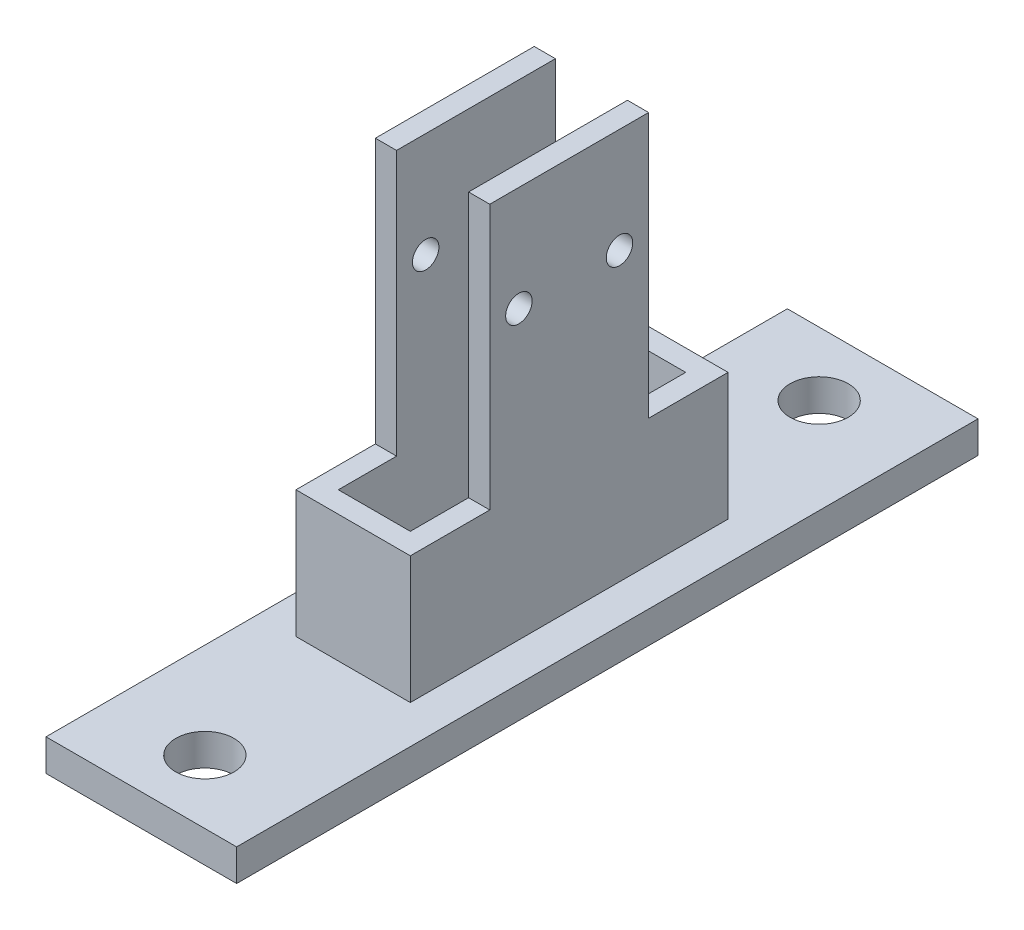
ISO-10303-21;
HEADER;
FILE_DESCRIPTION(('STEP AP214'),'2;1');
FILE_NAME('part.step','',(''),(''),'','','');
FILE_SCHEMA(('AUTOMOTIVE_DESIGN { 1 0 10303 214 1 1 1 1 }'));
ENDSEC;
DATA;
#1=APPLICATION_CONTEXT('core data for automotive mechanical design processes');
#2=APPLICATION_PROTOCOL_DEFINITION('international standard','automotive_design',2000,#1);
#3=PRODUCT_CONTEXT('',#1,'mechanical');
#4=PRODUCT('Part','Part','',(#3));
#5=PRODUCT_RELATED_PRODUCT_CATEGORY('part','',(#4));
#6=PRODUCT_DEFINITION_FORMATION('','',#4);
#7=PRODUCT_DEFINITION_CONTEXT('part definition',#1,'design');
#8=PRODUCT_DEFINITION('design','',#6,#7);
#9=PRODUCT_DEFINITION_SHAPE('','',#8);
#10=(LENGTH_UNIT() NAMED_UNIT(*) SI_UNIT(.MILLI.,.METRE.));
#11=(NAMED_UNIT(*) PLANE_ANGLE_UNIT() SI_UNIT($,.RADIAN.));
#12=(NAMED_UNIT(*) SI_UNIT($,.STERADIAN.) SOLID_ANGLE_UNIT());
#13=UNCERTAINTY_MEASURE_WITH_UNIT(LENGTH_MEASURE(1.E-05),#10,'distance_accuracy_value','');
#14=(GEOMETRIC_REPRESENTATION_CONTEXT(3) GLOBAL_UNCERTAINTY_ASSIGNED_CONTEXT((#13)) GLOBAL_UNIT_ASSIGNED_CONTEXT((#10,
#11,#12)) REPRESENTATION_CONTEXT('',''));
#15=CARTESIAN_POINT('',(0.,0.,0.));
#16=DIRECTION('',(0.,0.,1.));
#17=DIRECTION('',(1.,0.,0.));
#18=AXIS2_PLACEMENT_3D('',#15,#16,#17);
#19=CARTESIAN_POINT('',(0.,3.,0.));
#20=DIRECTION('',(0.,-1.00000000000002,0.));
#21=DIRECTION('',(0.,0.,-1.00000000000002));
#22=AXIS2_PLACEMENT_3D('',#19,#20,#21);
#23=PLANE('',#22);
#24=CARTESIAN_POINT('',(0.,3.00000000000056,-29.0000000000001));
#25=DIRECTION('',(0.,1.00000000000002,0.));
#26=DIRECTION('',(0.,0.,1.00000000000002));
#27=AXIS2_PLACEMENT_3D('',#24,#25,#26);
#28=CIRCLE('',#27,2.75);
#29=CARTESIAN_POINT('',(0.,3.00000000000056,-26.25));
#30=VERTEX_POINT('',#29);
#31=EDGE_CURVE('E593',#30,#30,#28,.T.);
#32=ORIENTED_EDGE('',*,*,#31,.F.);
#33=EDGE_LOOP('',(#32));
#34=FACE_BOUND('',#33,.T.);
#35=CARTESIAN_POINT('',(0.,3.00000000000034,29.));
#36=DIRECTION('',(0.,1.00000000000002,0.));
#37=DIRECTION('',(0.,0.,1.00000000000002));
#38=AXIS2_PLACEMENT_3D('',#35,#36,#37);
#39=CIRCLE('',#38,2.75);
#40=CARTESIAN_POINT('',(0.,3.00000000000034,31.7500000000001));
#41=VERTEX_POINT('',#40);
#42=EDGE_CURVE('E595',#41,#41,#39,.T.);
#43=ORIENTED_EDGE('',*,*,#42,.F.);
#44=EDGE_LOOP('',(#43));
#45=FACE_BOUND('',#44,.T.);
#46=DIRECTION('',(1.,0.,0.));
#47=VECTOR('',#46,1.);
#48=CARTESIAN_POINT('',(-22.5,2.99999999999911,15.0000000000002));
#49=LINE('',#48,#47);
#50=CARTESIAN_POINT('',(-5.40000000000007,2.99999999999917,15.0000000000002));
#51=VERTEX_POINT('',#50);
#52=CARTESIAN_POINT('',(5.40000000000007,3.,14.9999999999998));
#53=VERTEX_POINT('',#52);
#54=EDGE_CURVE('E230',#51,#53,#49,.T.);
#55=ORIENTED_EDGE('',*,*,#54,.F.);
#56=DIRECTION('',(0.,0.,1.00000000000002));
#57=VECTOR('',#56,1.);
#58=CARTESIAN_POINT('',(-5.40000000000007,2.99999999999923,2.22044604925031E-13));
#59=LINE('',#58,#57);
#60=CARTESIAN_POINT('',(-5.40000000000007,2.99999999999945,-15.0000000000002));
#61=VERTEX_POINT('',#60);
#62=EDGE_CURVE('E11',#61,#51,#59,.T.);
#63=ORIENTED_EDGE('',*,*,#62,.F.);
#64=DIRECTION('',(1.,0.,0.));
#65=VECTOR('',#64,1.);
#66=CARTESIAN_POINT('',(-22.5,3.,-15.0000000000003));
#67=LINE('',#66,#65);
#68=CARTESIAN_POINT('',(5.40000000000007,3.,-15.0000000000003));
#69=VERTEX_POINT('',#68);
#70=EDGE_CURVE('E223',#61,#69,#67,.T.);
#71=ORIENTED_EDGE('',*,*,#70,.T.);
#72=DIRECTION('',(0.,0.,1.00000000000002));
#73=VECTOR('',#72,1.);
#74=CARTESIAN_POINT('',(5.40000000000007,3.,-2.22044604925031E-13));
#75=LINE('',#74,#73);
#76=EDGE_CURVE('E306',#69,#53,#75,.T.);
#77=ORIENTED_EDGE('',*,*,#76,.T.);
#78=EDGE_LOOP('',(#55,#63,#71,#77));
#79=FACE_BOUND('',#78,.T.);
#80=DIRECTION('',(0.,0.,-1.00000000000002));
#81=VECTOR('',#80,1.);
#82=CARTESIAN_POINT('',(8.99999999999991,2.99999999999989,-35.0000000000005));
#83=LINE('',#82,#81);
#84=CARTESIAN_POINT('',(9.00000000000012,3.00000000000022,35.));
#85=VERTEX_POINT('',#84);
#86=CARTESIAN_POINT('',(8.99999999999991,2.99999999999989,-35.0000000000005));
#87=VERTEX_POINT('',#86);
#88=EDGE_CURVE('E214',#85,#87,#83,.T.);
#89=ORIENTED_EDGE('',*,*,#88,.T.);
#90=DIRECTION('',(-1.,0.,0.));
#91=VECTOR('',#90,1.);
#92=CARTESIAN_POINT('',(-8.99999999999989,2.99999999999923,-35.0000000000005));
#93=LINE('',#92,#91);
#94=CARTESIAN_POINT('',(-8.99999999999989,2.99999999999923,-35.0000000000005));
#95=VERTEX_POINT('',#94);
#96=EDGE_CURVE('E202',#87,#95,#93,.T.);
#97=ORIENTED_EDGE('',*,*,#96,.T.);
#98=DIRECTION('',(0.,0.,1.00000000000002));
#99=VECTOR('',#98,1.);
#100=CARTESIAN_POINT('',(-8.99999999999989,2.99999999999923,-35.0000000000005));
#101=LINE('',#100,#99);
#102=CARTESIAN_POINT('',(-8.9999999999999,2.99999999999956,35.0000000000003));
#103=VERTEX_POINT('',#102);
#104=EDGE_CURVE('E218',#95,#103,#101,.T.);
#105=ORIENTED_EDGE('',*,*,#104,.T.);
#106=DIRECTION('',(1.,0.,0.));
#107=VECTOR('',#106,1.);
#108=CARTESIAN_POINT('',(-8.9999999999999,2.99999999999956,35.0000000000003));
#109=LINE('',#108,#107);
#110=EDGE_CURVE('E195',#103,#85,#109,.T.);
#111=ORIENTED_EDGE('',*,*,#110,.T.);
#112=EDGE_LOOP('',(#89,#97,#105,#111));
#113=FACE_BOUND('',#112,.T.);
#114=ADVANCED_FACE('F45',(#34,#45,#79,#113),#23,.F.);
#115=CARTESIAN_POINT('',(0.,0.,0.));
#116=DIRECTION('',(0.,-1.00000000000002,0.));
#117=DIRECTION('',(0.,0.,-1.00000000000002));
#118=AXIS2_PLACEMENT_3D('',#115,#116,#117);
#119=PLANE('',#118);
#120=CARTESIAN_POINT('',(0.,0.,-29.0000000000001));
#121=DIRECTION('',(0.,1.00000000000002,0.));
#122=DIRECTION('',(0.,0.,1.00000000000002));
#123=AXIS2_PLACEMENT_3D('',#120,#121,#122);
#124=CIRCLE('',#123,2.75);
#125=CARTESIAN_POINT('',(0.,0.,-26.25));
#126=VERTEX_POINT('',#125);
#127=EDGE_CURVE('E590',#126,#126,#124,.T.);
#128=ORIENTED_EDGE('',*,*,#127,.T.);
#129=EDGE_LOOP('',(#128));
#130=FACE_BOUND('',#129,.T.);
#131=CARTESIAN_POINT('',(0.,2.77555756156289E-13,29.));
#132=DIRECTION('',(0.,1.00000000000002,0.));
#133=DIRECTION('',(0.,0.,1.00000000000002));
#134=AXIS2_PLACEMENT_3D('',#131,#132,#133);
#135=CIRCLE('',#134,2.75);
#136=CARTESIAN_POINT('',(0.,2.77555756156289E-13,31.7500000000001));
#137=VERTEX_POINT('',#136);
#138=EDGE_CURVE('E216',#137,#137,#135,.T.);
#139=ORIENTED_EDGE('',*,*,#138,.T.);
#140=EDGE_LOOP('',(#139));
#141=FACE_BOUND('',#140,.T.);
#142=DIRECTION('',(-1.,0.,0.));
#143=VECTOR('',#142,1.);
#144=CARTESIAN_POINT('',(-8.99999999999989,-7.7715611723761E-13,-35.0000000000005));
#145=LINE('',#144,#143);
#146=CARTESIAN_POINT('',(8.99999999999992,-1.11022302462516E-13,-35.0000000000006));
#147=VERTEX_POINT('',#146);
#148=CARTESIAN_POINT('',(-8.99999999999989,-7.7715611723761E-13,-35.0000000000005));
#149=VERTEX_POINT('',#148);
#150=EDGE_CURVE('E194',#147,#149,#145,.T.);
#151=ORIENTED_EDGE('',*,*,#150,.F.);
#152=DIRECTION('',(0.,0.,-1.00000000000002));
#153=VECTOR('',#152,1.);
#154=CARTESIAN_POINT('',(8.99999999999992,-1.11022302462516E-13,-35.0000000000006));
#155=LINE('',#154,#153);
#156=CARTESIAN_POINT('',(8.99999999999989,3.33066907387547E-13,35.0000000000003));
#157=VERTEX_POINT('',#156);
#158=EDGE_CURVE('E183',#157,#147,#155,.T.);
#159=ORIENTED_EDGE('',*,*,#158,.F.);
#160=DIRECTION('',(1.,0.,0.));
#161=VECTOR('',#160,1.);
#162=CARTESIAN_POINT('',(-8.9999999999999,-4.44089209850063E-13,35.0000000000003));
#163=LINE('',#162,#161);
#164=CARTESIAN_POINT('',(-8.9999999999999,-4.44089209850063E-13,35.0000000000003));
#165=VERTEX_POINT('',#164);
#166=EDGE_CURVE('E204',#165,#157,#163,.T.);
#167=ORIENTED_EDGE('',*,*,#166,.F.);
#168=DIRECTION('',(0.,0.,1.00000000000002));
#169=VECTOR('',#168,1.);
#170=CARTESIAN_POINT('',(-8.99999999999989,-7.7715611723761E-13,-35.0000000000005));
#171=LINE('',#170,#169);
#172=EDGE_CURVE('E207',#149,#165,#171,.T.);
#173=ORIENTED_EDGE('',*,*,#172,.F.);
#174=EDGE_LOOP('',(#151,#159,#167,#173));
#175=FACE_BOUND('',#174,.T.);
#176=ADVANCED_FACE('F206',(#130,#141,#175),#119,.T.);
#177=CARTESIAN_POINT('',(-22.5,2.99999999999911,15.0000000000002));
#178=DIRECTION('',(0.,0.,-1.00000000000002));
#179=DIRECTION('',(-1.,0.,0.));
#180=AXIS2_PLACEMENT_3D('',#177,#178,#179);
#181=PLANE('',#180);
#182=DIRECTION('',(0.,-1.00000000000002,0.));
#183=VECTOR('',#182,1.);
#184=CARTESIAN_POINT('',(-5.40000000000007,-8.32667268468867E-13,15.0000000000002));
#185=LINE('',#184,#183);
#186=CARTESIAN_POINT('',(-5.40000000000006,14.9999999999992,14.9999999999995));
#187=VERTEX_POINT('',#186);
#188=EDGE_CURVE('E319',#187,#51,#185,.T.);
#189=ORIENTED_EDGE('',*,*,#188,.T.);
#190=ORIENTED_EDGE('',*,*,#54,.T.);
#191=DIRECTION('',(0.,-1.00000000000002,0.));
#192=VECTOR('',#191,1.);
#193=CARTESIAN_POINT('',(5.40000000000007,0.,14.9999999999998));
#194=LINE('',#193,#192);
#195=CARTESIAN_POINT('',(5.40000000000009,15.,14.9999999999995));
#196=VERTEX_POINT('',#195);
#197=EDGE_CURVE('E261',#196,#53,#194,.T.);
#198=ORIENTED_EDGE('',*,*,#197,.F.);
#199=DIRECTION('',(1.,0.,0.));
#200=VECTOR('',#199,1.);
#201=CARTESIAN_POINT('',(-5.40000000000006,14.9999999999992,14.9999999999995));
#202=LINE('',#201,#200);
#203=EDGE_CURVE('E336',#187,#196,#202,.T.);
#204=ORIENTED_EDGE('',*,*,#203,.F.);
#205=EDGE_LOOP('',(#189,#190,#198,#204));
#206=FACE_BOUND('',#205,.T.);
#207=ADVANCED_FACE('F47',(#206),#181,.F.);
#208=CARTESIAN_POINT('',(-22.5,3.,-15.0000000000003));
#209=DIRECTION('',(0.,0.,-1.00000000000002));
#210=DIRECTION('',(-1.,0.,0.));
#211=AXIS2_PLACEMENT_3D('',#208,#209,#210);
#212=PLANE('',#211);
#213=ORIENTED_EDGE('',*,*,#70,.F.);
#214=DIRECTION('',(0.,-1.00000000000002,0.));
#215=VECTOR('',#214,1.);
#216=CARTESIAN_POINT('',(-5.40000000000007,-8.32667268468867E-13,-14.9999999999998));
#217=LINE('',#216,#215);
#218=CARTESIAN_POINT('',(-5.40000000000006,14.9999999999997,-15.0000000000005));
#219=VERTEX_POINT('',#218);
#220=EDGE_CURVE('E322',#219,#61,#217,.T.);
#221=ORIENTED_EDGE('',*,*,#220,.F.);
#222=DIRECTION('',(1.,0.,0.));
#223=VECTOR('',#222,1.);
#224=CARTESIAN_POINT('',(-5.40000000000006,14.9999999999997,-15.0000000000005));
#225=LINE('',#224,#223);
#226=CARTESIAN_POINT('',(5.40000000000008,15.0000000000001,-15.0000000000006));
#227=VERTEX_POINT('',#226);
#228=EDGE_CURVE('E365',#219,#227,#225,.T.);
#229=ORIENTED_EDGE('',*,*,#228,.T.);
#230=DIRECTION('',(0.,-1.00000000000002,0.));
#231=VECTOR('',#230,1.);
#232=CARTESIAN_POINT('',(5.40000000000007,0.,-15.0000000000003));
#233=LINE('',#232,#231);
#234=EDGE_CURVE('E264',#227,#69,#233,.T.);
#235=ORIENTED_EDGE('',*,*,#234,.T.);
#236=EDGE_LOOP('',(#213,#221,#229,#235));
#237=FACE_BOUND('',#236,.T.);
#238=ADVANCED_FACE('F428',(#237),#212,.T.);
#239=DIRECTION('',(0.,0.,1.00000000000002));
#240=VECTOR('',#239,1.);
#241=CARTESIAN_POINT('',(3.40000000000007,3.,-2.22044604925031E-13));
#242=LINE('',#241,#240);
#243=CARTESIAN_POINT('',(3.40000000000007,3.,-13.0000000000003));
#244=VERTEX_POINT('',#243);
#245=CARTESIAN_POINT('',(3.40000000000006,3.,12.9999999999998));
#246=VERTEX_POINT('',#245);
#247=EDGE_CURVE('E298',#244,#246,#242,.T.);
#248=ORIENTED_EDGE('',*,*,#247,.F.);
#249=DIRECTION('',(1.,0.,0.));
#250=VECTOR('',#249,1.);
#251=CARTESIAN_POINT('',(-5.40000000000007,2.99999999999928,-13.0000000000002));
#252=LINE('',#251,#250);
#253=CARTESIAN_POINT('',(-3.40000000000007,3.,-12.9999999999998));
#254=VERTEX_POINT('',#253);
#255=EDGE_CURVE('E60',#254,#244,#252,.T.);
#256=ORIENTED_EDGE('',*,*,#255,.F.);
#257=DIRECTION('',(0.,0.,1.00000000000002));
#258=VECTOR('',#257,1.);
#259=CARTESIAN_POINT('',(-3.40000000000007,3.00000000000006,2.22044604925031E-13));
#260=LINE('',#259,#258);
#261=CARTESIAN_POINT('',(-3.40000000000008,3.,13.0000000000002));
#262=VERTEX_POINT('',#261);
#263=EDGE_CURVE('E53',#254,#262,#260,.T.);
#264=ORIENTED_EDGE('',*,*,#263,.T.);
#265=DIRECTION('',(1.,0.,0.));
#266=VECTOR('',#265,1.);
#267=CARTESIAN_POINT('',(-5.40000000000007,2.99999999999911,13.0000000000002));
#268=LINE('',#267,#266);
#269=EDGE_CURVE('E240',#262,#246,#268,.T.);
#270=ORIENTED_EDGE('',*,*,#269,.T.);
#271=EDGE_LOOP('',(#248,#256,#264,#270));
#272=FACE_BOUND('',#271,.T.);
#273=ADVANCED_FACE('F368',(#272),#23,.F.);
#274=CARTESIAN_POINT('',(-5.40000000000007,-7.7715611723761E-13,2.22044604925031E-13));
#275=DIRECTION('',(1.,0.,0.));
#276=DIRECTION('',(0.,0.,-1.00000000000002));
#277=AXIS2_PLACEMENT_3D('',#274,#275,#276);
#278=PLANE('',#277);
#279=CARTESIAN_POINT('',(-5.40000000000163,30.0999999999994,-4.74999999999964));
#280=DIRECTION('',(1.,0.,0.));
#281=DIRECTION('',(0.,0.,-1.00000000000002));
#282=AXIS2_PLACEMENT_3D('',#279,#280,#281);
#283=CIRCLE('',#282,1.25);
#284=CARTESIAN_POINT('',(-5.40000000000163,30.0999999999994,-5.99999999999966));
#285=VERTEX_POINT('',#284);
#286=EDGE_CURVE('E310',#285,#285,#283,.T.);
#287=ORIENTED_EDGE('',*,*,#286,.T.);
#288=EDGE_LOOP('',(#287));
#289=FACE_BOUND('',#288,.T.);
#290=CARTESIAN_POINT('',(-5.40000000000163,30.0999999999993,4.75000000000048));
#291=DIRECTION('',(1.,0.,0.));
#292=DIRECTION('',(0.,0.,-1.00000000000002));
#293=AXIS2_PLACEMENT_3D('',#290,#291,#292);
#294=CIRCLE('',#293,1.25);
#295=CARTESIAN_POINT('',(-5.40000000000163,30.0999999999993,3.50000000000045));
#296=VERTEX_POINT('',#295);
#297=EDGE_CURVE('E313',#296,#296,#294,.T.);
#298=ORIENTED_EDGE('',*,*,#297,.T.);
#299=EDGE_LOOP('',(#298));
#300=FACE_BOUND('',#299,.T.);
#301=DIRECTION('',(0.,-1.00000000000002,0.));
#302=VECTOR('',#301,1.);
#303=CARTESIAN_POINT('',(-5.40000000000007,-7.21644966006352E-13,-7.49999999999979));
#304=LINE('',#303,#302);
#305=CARTESIAN_POINT('',(-5.40000000000139,39.9999999999999,-7.49999999999962));
#306=VERTEX_POINT('',#305);
#307=CARTESIAN_POINT('',(-5.40000000000006,14.9999999999993,-7.50000000000051));
#308=VERTEX_POINT('',#307);
#309=EDGE_CURVE('E327',#306,#308,#304,.T.);
#310=ORIENTED_EDGE('',*,*,#309,.T.);
#311=DIRECTION('',(0.,0.,1.00000000000002));
#312=VECTOR('',#311,1.);
#313=CARTESIAN_POINT('',(-5.40000000000007,14.9999999999993,-4.9960036108132E-13));
#314=LINE('',#313,#312);
#315=EDGE_CURVE('E325',#219,#308,#314,.T.);
#316=ORIENTED_EDGE('',*,*,#315,.F.);
#317=ORIENTED_EDGE('',*,*,#220,.T.);
#318=ORIENTED_EDGE('',*,*,#62,.T.);
#319=ORIENTED_EDGE('',*,*,#188,.F.);
#320=DIRECTION('',(0.,0.,1.00000000000002));
#321=VECTOR('',#320,1.);
#322=CARTESIAN_POINT('',(-5.40000000000007,14.9999999999993,-4.9960036108132E-13));
#323=LINE('',#322,#321);
#324=CARTESIAN_POINT('',(-5.40000000000007,14.9999999999992,7.49999999999951));
#325=VERTEX_POINT('',#324);
#326=EDGE_CURVE('E317',#325,#187,#323,.T.);
#327=ORIENTED_EDGE('',*,*,#326,.F.);
#328=DIRECTION('',(0.,-1.00000000000002,0.));
#329=VECTOR('',#328,1.);
#330=CARTESIAN_POINT('',(-5.40000000000007,-8.88178419700125E-13,7.50000000000023));
#331=LINE('',#330,#329);
#332=CARTESIAN_POINT('',(-5.4000000000014,39.9999999999995,7.50000000000045));
#333=VERTEX_POINT('',#332);
#334=EDGE_CURVE('E333',#333,#325,#331,.T.);
#335=ORIENTED_EDGE('',*,*,#334,.F.);
#336=DIRECTION('',(0.,0.,-1.00000000000002));
#337=VECTOR('',#336,1.);
#338=CARTESIAN_POINT('',(-5.40000000000163,39.9999999999995,3.88578058618805E-13));
#339=LINE('',#338,#337);
#340=EDGE_CURVE('E330',#333,#306,#339,.T.);
#341=ORIENTED_EDGE('',*,*,#340,.T.);
#342=EDGE_LOOP('',(#310,#316,#317,#318,#319,#327,#335,#341));
#343=FACE_BOUND('',#342,.T.);
#344=ADVANCED_FACE('F404',(#289,#300,#343),#278,.F.);
#345=CARTESIAN_POINT('',(-3.40000000000007,0.,2.22044604925031E-13));
#346=DIRECTION('',(1.,0.,0.));
#347=DIRECTION('',(0.,0.,-1.00000000000002));
#348=AXIS2_PLACEMENT_3D('',#345,#346,#347);
#349=PLANE('',#348);
#350=DIRECTION('',(0.,-1.00000000000002,0.));
#351=VECTOR('',#350,1.);
#352=CARTESIAN_POINT('',(-3.40000000000007,0.,-12.9999999999998));
#353=LINE('',#352,#351);
#354=CARTESIAN_POINT('',(-3.40000000000006,15.0000000000001,-13.0000000000006));
#355=VERTEX_POINT('',#354);
#356=EDGE_CURVE('E67',#355,#254,#353,.T.);
#357=ORIENTED_EDGE('',*,*,#356,.F.);
#358=DIRECTION('',(0.,0.,1.00000000000002));
#359=VECTOR('',#358,1.);
#360=CARTESIAN_POINT('',(-3.40000000000007,15.0000000000001,-4.9960036108132E-13));
#361=LINE('',#360,#359);
#362=CARTESIAN_POINT('',(-3.40000000000007,15.0000000000001,-7.50000000000051));
#363=VERTEX_POINT('',#362);
#364=EDGE_CURVE('E345',#355,#363,#361,.T.);
#365=ORIENTED_EDGE('',*,*,#364,.T.);
#366=DIRECTION('',(0.,-1.00000000000002,0.));
#367=VECTOR('',#366,1.);
#368=CARTESIAN_POINT('',(-3.40000000000007,0.,-7.49999999999984));
#369=LINE('',#368,#367);
#370=CARTESIAN_POINT('',(-3.40000000000162,40.0000000000003,-7.49999999999956));
#371=VERTEX_POINT('',#370);
#372=EDGE_CURVE('E347',#371,#363,#369,.T.);
#373=ORIENTED_EDGE('',*,*,#372,.F.);
#374=DIRECTION('',(0.,0.,-1.00000000000002));
#375=VECTOR('',#374,1.);
#376=CARTESIAN_POINT('',(-3.40000000000162,40.0000000000003,4.44089209850063E-13));
#377=LINE('',#376,#375);
#378=CARTESIAN_POINT('',(-3.40000000000163,40.0000000000003,7.50000000000045));
#379=VERTEX_POINT('',#378);
#380=EDGE_CURVE('E350',#379,#371,#377,.T.);
#381=ORIENTED_EDGE('',*,*,#380,.F.);
#382=DIRECTION('',(0.,-1.00000000000002,0.));
#383=VECTOR('',#382,1.);
#384=CARTESIAN_POINT('',(-3.40000000000007,0.,7.50000000000023));
#385=LINE('',#384,#383);
#386=CARTESIAN_POINT('',(-3.40000000000008,15.,7.49999999999951));
#387=VERTEX_POINT('',#386);
#388=EDGE_CURVE('E314',#379,#387,#385,.T.);
#389=ORIENTED_EDGE('',*,*,#388,.T.);
#390=DIRECTION('',(0.,0.,1.00000000000002));
#391=VECTOR('',#390,1.);
#392=CARTESIAN_POINT('',(-3.40000000000007,15.0000000000001,-4.9960036108132E-13));
#393=LINE('',#392,#391);
#394=CARTESIAN_POINT('',(-3.40000000000006,15.,12.9999999999995));
#395=VERTEX_POINT('',#394);
#396=EDGE_CURVE('E342',#387,#395,#393,.T.);
#397=ORIENTED_EDGE('',*,*,#396,.T.);
#398=DIRECTION('',(0.,1.00000000000002,0.));
#399=VECTOR('',#398,1.);
#400=CARTESIAN_POINT('',(-3.40000000000008,0.,13.0000000000002));
#401=LINE('',#400,#399);
#402=EDGE_CURVE('E248',#262,#395,#401,.T.);
#403=ORIENTED_EDGE('',*,*,#402,.F.);
#404=ORIENTED_EDGE('',*,*,#263,.F.);
#405=EDGE_LOOP('',(#357,#365,#373,#381,#389,#397,#403,#404));
#406=FACE_BOUND('',#405,.T.);
#407=CARTESIAN_POINT('',(-3.40000000000163,30.1000000000001,4.75000000000042));
#408=DIRECTION('',(1.,0.,0.));
#409=DIRECTION('',(0.,0.,-1.00000000000002));
#410=AXIS2_PLACEMENT_3D('',#407,#408,#409);
#411=CIRCLE('',#410,1.25);
#412=CARTESIAN_POINT('',(-3.40000000000163,30.1000000000001,3.5000000000004));
#413=VERTEX_POINT('',#412);
#414=EDGE_CURVE('E339',#413,#413,#411,.T.);
#415=ORIENTED_EDGE('',*,*,#414,.F.);
#416=EDGE_LOOP('',(#415));
#417=FACE_BOUND('',#416,.T.);
#418=CARTESIAN_POINT('',(-3.40000000000163,30.1000000000001,-4.75000000000025));
#419=DIRECTION('',(1.,0.,0.));
#420=DIRECTION('',(0.,0.,-1.00000000000002));
#421=AXIS2_PLACEMENT_3D('',#418,#419,#420);
#422=CIRCLE('',#421,1.25);
#423=CARTESIAN_POINT('',(-3.40000000000163,30.1000000000001,-6.00000000000027));
#424=VERTEX_POINT('',#423);
#425=EDGE_CURVE('E309',#424,#424,#422,.T.);
#426=ORIENTED_EDGE('',*,*,#425,.F.);
#427=EDGE_LOOP('',(#426));
#428=FACE_BOUND('',#427,.T.);
#429=ADVANCED_FACE('F374',(#406,#417,#428),#349,.T.);
#430=CARTESIAN_POINT('',(-5.40000000000007,14.9999999999993,-4.9960036108132E-13));
#431=DIRECTION('',(0.,1.00000000000002,0.));
#432=DIRECTION('',(0.,0.,1.00000000000002));
#433=AXIS2_PLACEMENT_3D('',#430,#431,#432);
#434=PLANE('',#433);
#435=ORIENTED_EDGE('',*,*,#326,.T.);
#436=ORIENTED_EDGE('',*,*,#203,.T.);
#437=DIRECTION('',(0.,0.,1.00000000000002));
#438=VECTOR('',#437,1.);
#439=CARTESIAN_POINT('',(5.40000000000007,15.,-4.9960036108132E-13));
#440=LINE('',#439,#438);
#441=CARTESIAN_POINT('',(5.40000000000007,15.0000000000001,7.49999999999951));
#442=VERTEX_POINT('',#441);
#443=EDGE_CURVE('E258',#442,#196,#440,.T.);
#444=ORIENTED_EDGE('',*,*,#443,.F.);
#445=DIRECTION('',(-1.,0.,0.));
#446=VECTOR('',#445,1.);
#447=CARTESIAN_POINT('',(5.40000000000007,15.0000000000001,7.49999999999951));
#448=LINE('',#447,#446);
#449=CARTESIAN_POINT('',(3.40000000000006,15.,7.49999999999951));
#450=VERTEX_POINT('',#449);
#451=EDGE_CURVE('E296',#442,#450,#448,.T.);
#452=ORIENTED_EDGE('',*,*,#451,.T.);
#453=DIRECTION('',(0.,0.,1.00000000000002));
#454=VECTOR('',#453,1.);
#455=CARTESIAN_POINT('',(3.40000000000007,15.0000000000001,-4.9960036108132E-13));
#456=LINE('',#455,#454);
#457=CARTESIAN_POINT('',(3.40000000000008,15.,12.9999999999995));
#458=VERTEX_POINT('',#457);
#459=EDGE_CURVE('E283',#450,#458,#456,.T.);
#460=ORIENTED_EDGE('',*,*,#459,.T.);
#461=DIRECTION('',(1.,0.,0.));
#462=VECTOR('',#461,1.);
#463=CARTESIAN_POINT('',(-5.40000000000006,14.9999999999992,12.9999999999995));
#464=LINE('',#463,#462);
#465=EDGE_CURVE('E243',#395,#458,#464,.T.);
#466=ORIENTED_EDGE('',*,*,#465,.F.);
#467=ORIENTED_EDGE('',*,*,#396,.F.);
#468=DIRECTION('',(1.,0.,0.));
#469=VECTOR('',#468,1.);
#470=CARTESIAN_POINT('',(-5.40000000000007,14.9999999999992,7.49999999999951));
#471=LINE('',#470,#469);
#472=EDGE_CURVE('E355',#325,#387,#471,.T.);
#473=ORIENTED_EDGE('',*,*,#472,.F.);
#474=EDGE_LOOP('',(#435,#436,#444,#452,#460,#466,#467,#473));
#475=FACE_BOUND('',#474,.T.);
#476=ADVANCED_FACE('F380',(#475),#434,.T.);
#477=CARTESIAN_POINT('',(-5.40000000000007,-8.88178419700125E-13,7.50000000000023));
#478=DIRECTION('',(0.,0.,1.00000000000002));
#479=DIRECTION('',(0.,-1.00000000000002,0.));
#480=AXIS2_PLACEMENT_3D('',#477,#478,#479);
#481=PLANE('',#480);
#482=ORIENTED_EDGE('',*,*,#388,.F.);
#483=DIRECTION('',(1.,0.,0.));
#484=VECTOR('',#483,1.);
#485=CARTESIAN_POINT('',(-5.4000000000014,39.9999999999995,7.50000000000045));
#486=LINE('',#485,#484);
#487=EDGE_CURVE('E357',#333,#379,#486,.T.);
#488=ORIENTED_EDGE('',*,*,#487,.F.);
#489=ORIENTED_EDGE('',*,*,#334,.T.);
#490=ORIENTED_EDGE('',*,*,#472,.T.);
#491=EDGE_LOOP('',(#482,#488,#489,#490));
#492=FACE_BOUND('',#491,.T.);
#493=ADVANCED_FACE('F402',(#492),#481,.T.);
#494=CARTESIAN_POINT('',(-5.40000000000163,39.9999999999995,3.88578058618805E-13));
#495=DIRECTION('',(0.,-1.00000000000002,0.));
#496=DIRECTION('',(0.,0.,-1.00000000000002));
#497=AXIS2_PLACEMENT_3D('',#494,#495,#496);
#498=PLANE('',#497);
#499=ORIENTED_EDGE('',*,*,#380,.T.);
#500=DIRECTION('',(1.,0.,0.));
#501=VECTOR('',#500,1.);
#502=CARTESIAN_POINT('',(-5.40000000000139,39.9999999999999,-7.49999999999962));
#503=LINE('',#502,#501);
#504=EDGE_CURVE('E359',#306,#371,#503,.T.);
#505=ORIENTED_EDGE('',*,*,#504,.F.);
#506=ORIENTED_EDGE('',*,*,#340,.F.);
#507=ORIENTED_EDGE('',*,*,#487,.T.);
#508=EDGE_LOOP('',(#499,#505,#506,#507));
#509=FACE_BOUND('',#508,.T.);
#510=ADVANCED_FACE('F399',(#509),#498,.F.);
#511=CARTESIAN_POINT('',(-5.40000000000007,-7.21644966006352E-13,-7.49999999999979));
#512=DIRECTION('',(0.,0.,1.00000000000002));
#513=DIRECTION('',(0.,-1.00000000000002,0.));
#514=AXIS2_PLACEMENT_3D('',#511,#512,#513);
#515=PLANE('',#514);
#516=ORIENTED_EDGE('',*,*,#372,.T.);
#517=DIRECTION('',(1.,0.,0.));
#518=VECTOR('',#517,1.);
#519=CARTESIAN_POINT('',(-5.40000000000006,14.9999999999993,-7.50000000000051));
#520=LINE('',#519,#518);
#521=EDGE_CURVE('E362',#308,#363,#520,.T.);
#522=ORIENTED_EDGE('',*,*,#521,.F.);
#523=ORIENTED_EDGE('',*,*,#309,.F.);
#524=ORIENTED_EDGE('',*,*,#504,.T.);
#525=EDGE_LOOP('',(#516,#522,#523,#524));
#526=FACE_BOUND('',#525,.T.);
#527=ADVANCED_FACE('F396',(#526),#515,.F.);
#528=CARTESIAN_POINT('',(-5.40000000000007,14.9999999999993,-4.9960036108132E-13));
#529=DIRECTION('',(0.,1.00000000000002,0.));
#530=DIRECTION('',(0.,0.,1.00000000000002));
#531=AXIS2_PLACEMENT_3D('',#528,#529,#530);
#532=PLANE('',#531);
#533=ORIENTED_EDGE('',*,*,#364,.F.);
#534=DIRECTION('',(1.,0.,0.));
#535=VECTOR('',#534,1.);
#536=CARTESIAN_POINT('',(-5.40000000000006,14.9999999999996,-13.0000000000006));
#537=LINE('',#536,#535);
#538=CARTESIAN_POINT('',(3.40000000000008,15.,-13.000000000001));
#539=VERTEX_POINT('',#538);
#540=EDGE_CURVE('E233',#355,#539,#537,.T.);
#541=ORIENTED_EDGE('',*,*,#540,.T.);
#542=DIRECTION('',(0.,0.,1.00000000000002));
#543=VECTOR('',#542,1.);
#544=CARTESIAN_POINT('',(3.40000000000007,15.0000000000001,-4.9960036108132E-13));
#545=LINE('',#544,#543);
#546=CARTESIAN_POINT('',(3.40000000000007,15.,-7.50000000000095));
#547=VERTEX_POINT('',#546);
#548=EDGE_CURVE('E286',#539,#547,#545,.T.);
#549=ORIENTED_EDGE('',*,*,#548,.T.);
#550=DIRECTION('',(-1.,0.,0.));
#551=VECTOR('',#550,1.);
#552=CARTESIAN_POINT('',(5.40000000000008,15.0000000000002,-7.50000000000051));
#553=LINE('',#552,#551);
#554=CARTESIAN_POINT('',(5.40000000000008,15.0000000000002,-7.50000000000051));
#555=VERTEX_POINT('',#554);
#556=EDGE_CURVE('E277',#555,#547,#553,.T.);
#557=ORIENTED_EDGE('',*,*,#556,.F.);
#558=DIRECTION('',(0.,0.,1.00000000000002));
#559=VECTOR('',#558,1.);
#560=CARTESIAN_POINT('',(5.40000000000007,15.,-4.9960036108132E-13));
#561=LINE('',#560,#559);
#562=EDGE_CURVE('E266',#227,#555,#561,.T.);
#563=ORIENTED_EDGE('',*,*,#562,.F.);
#564=ORIENTED_EDGE('',*,*,#228,.F.);
#565=ORIENTED_EDGE('',*,*,#315,.T.);
#566=ORIENTED_EDGE('',*,*,#521,.T.);
#567=EDGE_LOOP('',(#533,#541,#549,#557,#563,#564,#565,#566));
#568=FACE_BOUND('',#567,.T.);
#569=ADVANCED_FACE('F391',(#568),#532,.T.);
#570=CARTESIAN_POINT('',(-5.40000000000163,30.0999999999993,4.75000000000048));
#571=DIRECTION('',(1.,0.,0.));
#572=DIRECTION('',(0.,0.,-1.00000000000002));
#573=AXIS2_PLACEMENT_3D('',#570,#571,#572);
#574=CYLINDRICAL_SURFACE('',#573,1.25);
#575=ORIENTED_EDGE('',*,*,#297,.F.);
#576=EDGE_LOOP('',(#575));
#577=FACE_BOUND('',#576,.T.);
#578=ORIENTED_EDGE('',*,*,#414,.T.);
#579=EDGE_LOOP('',(#578));
#580=FACE_BOUND('',#579,.T.);
#581=ADVANCED_FACE('F494',(#577,#580),#574,.F.);
#582=CARTESIAN_POINT('',(-5.40000000000163,30.0999999999994,-4.74999999999964));
#583=DIRECTION('',(1.,0.,0.));
#584=DIRECTION('',(0.,0.,-1.00000000000002));
#585=AXIS2_PLACEMENT_3D('',#582,#583,#584);
#586=CYLINDRICAL_SURFACE('',#585,1.25);
#587=ORIENTED_EDGE('',*,*,#286,.F.);
#588=EDGE_LOOP('',(#587));
#589=FACE_BOUND('',#588,.T.);
#590=ORIENTED_EDGE('',*,*,#425,.T.);
#591=EDGE_LOOP('',(#590));
#592=FACE_BOUND('',#591,.T.);
#593=ADVANCED_FACE('F464',(#589,#592),#586,.F.);
#594=CARTESIAN_POINT('',(5.40000000000007,0.,-2.77555756156289E-13));
#595=DIRECTION('',(-1.,0.,0.));
#596=DIRECTION('',(0.,0.,-1.00000000000002));
#597=AXIS2_PLACEMENT_3D('',#594,#595,#596);
#598=PLANE('',#597);
#599=CARTESIAN_POINT('',(5.39999999999829,30.1000000000002,-4.75000000000042));
#600=DIRECTION('',(1.,0.,0.));
#601=DIRECTION('',(0.,0.,-1.00000000000002));
#602=AXIS2_PLACEMENT_3D('',#599,#600,#601);
#603=CIRCLE('',#602,1.25);
#604=CARTESIAN_POINT('',(5.39999999999829,30.1000000000002,-6.00000000000044));
#605=VERTEX_POINT('',#604);
#606=EDGE_CURVE('E251',#605,#605,#603,.T.);
#607=ORIENTED_EDGE('',*,*,#606,.F.);
#608=EDGE_LOOP('',(#607));
#609=FACE_BOUND('',#608,.T.);
#610=CARTESIAN_POINT('',(5.39999999999829,30.1000000000001,4.75000000000042));
#611=DIRECTION('',(1.,0.,0.));
#612=DIRECTION('',(0.,0.,-1.00000000000002));
#613=AXIS2_PLACEMENT_3D('',#610,#611,#612);
#614=CIRCLE('',#613,1.25);
#615=CARTESIAN_POINT('',(5.39999999999829,30.1000000000001,3.5000000000004));
#616=VERTEX_POINT('',#615);
#617=EDGE_CURVE('E254',#616,#616,#614,.T.);
#618=ORIENTED_EDGE('',*,*,#617,.F.);
#619=EDGE_LOOP('',(#618));
#620=FACE_BOUND('',#619,.T.);
#621=ORIENTED_EDGE('',*,*,#197,.T.);
#622=ORIENTED_EDGE('',*,*,#76,.F.);
#623=ORIENTED_EDGE('',*,*,#234,.F.);
#624=ORIENTED_EDGE('',*,*,#562,.T.);
#625=DIRECTION('',(0.,-1.00000000000002,0.));
#626=VECTOR('',#625,1.);
#627=CARTESIAN_POINT('',(5.40000000000007,1.66533453693773E-13,-7.50000000000028));
#628=LINE('',#627,#626);
#629=CARTESIAN_POINT('',(5.39999999999853,40.0000000000004,-7.50000000000001));
#630=VERTEX_POINT('',#629);
#631=EDGE_CURVE('E268',#630,#555,#628,.T.);
#632=ORIENTED_EDGE('',*,*,#631,.F.);
#633=DIRECTION('',(0.,0.,-1.00000000000002));
#634=VECTOR('',#633,1.);
#635=CARTESIAN_POINT('',(5.3999999999983,40.0000000000001,0.));
#636=LINE('',#635,#634);
#637=CARTESIAN_POINT('',(5.39999999999852,40.0000000000001,7.50000000000045));
#638=VERTEX_POINT('',#637);
#639=EDGE_CURVE('E271',#638,#630,#636,.T.);
#640=ORIENTED_EDGE('',*,*,#639,.F.);
#641=DIRECTION('',(0.,-1.00000000000002,0.));
#642=VECTOR('',#641,1.);
#643=CARTESIAN_POINT('',(5.40000000000007,0.,7.49999999999979));
#644=LINE('',#643,#642);
#645=EDGE_CURVE('E274',#638,#442,#644,.T.);
#646=ORIENTED_EDGE('',*,*,#645,.T.);
#647=ORIENTED_EDGE('',*,*,#443,.T.);
#648=EDGE_LOOP('',(#621,#622,#623,#624,#632,#640,#646,#647));
#649=FACE_BOUND('',#648,.T.);
#650=ADVANCED_FACE('F412',(#609,#620,#649),#598,.F.);
#651=CARTESIAN_POINT('',(3.40000000000007,-1.11022302462516E-13,-2.22044604925031E-13));
#652=DIRECTION('',(-1.,0.,0.));
#653=DIRECTION('',(0.,0.,-1.00000000000002));
#654=AXIS2_PLACEMENT_3D('',#651,#652,#653);
#655=PLANE('',#654);
#656=DIRECTION('',(0.,1.00000000000002,0.));
#657=VECTOR('',#656,1.);
#658=CARTESIAN_POINT('',(3.40000000000007,0.,-13.0000000000003));
#659=LINE('',#658,#657);
#660=EDGE_CURVE('E236',#244,#539,#659,.T.);
#661=ORIENTED_EDGE('',*,*,#660,.F.);
#662=ORIENTED_EDGE('',*,*,#247,.T.);
#663=DIRECTION('',(0.,-1.00000000000002,0.));
#664=VECTOR('',#663,1.);
#665=CARTESIAN_POINT('',(3.40000000000006,0.,12.9999999999998));
#666=LINE('',#665,#664);
#667=EDGE_CURVE('E245',#458,#246,#666,.T.);
#668=ORIENTED_EDGE('',*,*,#667,.F.);
#669=ORIENTED_EDGE('',*,*,#459,.F.);
#670=DIRECTION('',(0.,-1.00000000000002,0.));
#671=VECTOR('',#670,1.);
#672=CARTESIAN_POINT('',(3.40000000000007,0.,7.49999999999979));
#673=LINE('',#672,#671);
#674=CARTESIAN_POINT('',(3.39999999999829,40.0000000000003,7.50000000000001));
#675=VERTEX_POINT('',#674);
#676=EDGE_CURVE('E255',#675,#450,#673,.T.);
#677=ORIENTED_EDGE('',*,*,#676,.F.);
#678=DIRECTION('',(0.,0.,-1.00000000000002));
#679=VECTOR('',#678,1.);
#680=CARTESIAN_POINT('',(3.39999999999829,40.0000000000003,0.));
#681=LINE('',#680,#679);
#682=CARTESIAN_POINT('',(3.3999999999983,40.0000000000003,-7.50000000000006));
#683=VERTEX_POINT('',#682);
#684=EDGE_CURVE('E291',#675,#683,#681,.T.);
#685=ORIENTED_EDGE('',*,*,#684,.T.);
#686=DIRECTION('',(0.,-1.00000000000002,0.));
#687=VECTOR('',#686,1.);
#688=CARTESIAN_POINT('',(3.40000000000007,0.,-7.50000000000023));
#689=LINE('',#688,#687);
#690=EDGE_CURVE('E288',#683,#547,#689,.T.);
#691=ORIENTED_EDGE('',*,*,#690,.T.);
#692=ORIENTED_EDGE('',*,*,#548,.F.);
#693=EDGE_LOOP('',(#661,#662,#668,#669,#677,#685,#691,#692));
#694=FACE_BOUND('',#693,.T.);
#695=CARTESIAN_POINT('',(3.39999999999828,30.1000000000001,4.75000000000048));
#696=DIRECTION('',(1.,0.,0.));
#697=DIRECTION('',(0.,0.,-1.00000000000002));
#698=AXIS2_PLACEMENT_3D('',#695,#696,#697);
#699=CIRCLE('',#698,1.25);
#700=CARTESIAN_POINT('',(3.39999999999828,30.1000000000001,3.50000000000045));
#701=VERTEX_POINT('',#700);
#702=EDGE_CURVE('E280',#701,#701,#699,.T.);
#703=ORIENTED_EDGE('',*,*,#702,.T.);
#704=EDGE_LOOP('',(#703));
#705=FACE_BOUND('',#704,.T.);
#706=CARTESIAN_POINT('',(3.39999999999829,30.1000000000001,-4.75000000000042));
#707=DIRECTION('',(1.,0.,0.));
#708=DIRECTION('',(0.,0.,-1.00000000000002));
#709=AXIS2_PLACEMENT_3D('',#706,#707,#708);
#710=CIRCLE('',#709,1.25);
#711=CARTESIAN_POINT('',(3.39999999999829,30.1000000000001,-6.00000000000044));
#712=VERTEX_POINT('',#711);
#713=EDGE_CURVE('E250',#712,#712,#710,.T.);
#714=ORIENTED_EDGE('',*,*,#713,.T.);
#715=EDGE_LOOP('',(#714));
#716=FACE_BOUND('',#715,.T.);
#717=ADVANCED_FACE('F384',(#694,#705,#716),#655,.T.);
#718=CARTESIAN_POINT('',(5.40000000000007,0.,7.49999999999979));
#719=DIRECTION('',(0.,0.,1.00000000000002));
#720=DIRECTION('',(0.,-1.00000000000002,0.));
#721=AXIS2_PLACEMENT_3D('',#718,#719,#720);
#722=PLANE('',#721);
#723=ORIENTED_EDGE('',*,*,#676,.T.);
#724=ORIENTED_EDGE('',*,*,#451,.F.);
#725=ORIENTED_EDGE('',*,*,#645,.F.);
#726=DIRECTION('',(-1.,0.,0.));
#727=VECTOR('',#726,1.);
#728=CARTESIAN_POINT('',(5.39999999999852,40.0000000000001,7.50000000000045));
#729=LINE('',#728,#727);
#730=EDGE_CURVE('E299',#638,#675,#729,.T.);
#731=ORIENTED_EDGE('',*,*,#730,.T.);
#732=EDGE_LOOP('',(#723,#724,#725,#731));
#733=FACE_BOUND('',#732,.T.);
#734=ADVANCED_FACE('F417',(#733),#722,.T.);
#735=CARTESIAN_POINT('',(5.3999999999983,40.0000000000001,0.));
#736=DIRECTION('',(0.,-1.00000000000002,0.));
#737=DIRECTION('',(0.,0.,-1.00000000000002));
#738=AXIS2_PLACEMENT_3D('',#735,#736,#737);
#739=PLANE('',#738);
#740=ORIENTED_EDGE('',*,*,#684,.F.);
#741=ORIENTED_EDGE('',*,*,#730,.F.);
#742=ORIENTED_EDGE('',*,*,#639,.T.);
#743=DIRECTION('',(-1.,0.,0.));
#744=VECTOR('',#743,1.);
#745=CARTESIAN_POINT('',(5.39999999999853,40.0000000000004,-7.50000000000001));
#746=LINE('',#745,#744);
#747=EDGE_CURVE('E301',#630,#683,#746,.T.);
#748=ORIENTED_EDGE('',*,*,#747,.T.);
#749=EDGE_LOOP('',(#740,#741,#742,#748));
#750=FACE_BOUND('',#749,.T.);
#751=ADVANCED_FACE('F421',(#750),#739,.F.);
#752=CARTESIAN_POINT('',(5.40000000000007,1.66533453693773E-13,-7.50000000000028));
#753=DIRECTION('',(0.,0.,1.00000000000002));
#754=DIRECTION('',(0.,-1.00000000000002,0.));
#755=AXIS2_PLACEMENT_3D('',#752,#753,#754);
#756=PLANE('',#755);
#757=ORIENTED_EDGE('',*,*,#690,.F.);
#758=ORIENTED_EDGE('',*,*,#747,.F.);
#759=ORIENTED_EDGE('',*,*,#631,.T.);
#760=ORIENTED_EDGE('',*,*,#556,.T.);
#761=EDGE_LOOP('',(#757,#758,#759,#760));
#762=FACE_BOUND('',#761,.T.);
#763=ADVANCED_FACE('F424',(#762),#756,.F.);
#764=CARTESIAN_POINT('',(5.39999999999829,30.1000000000001,4.75000000000042));
#765=DIRECTION('',(-1.,0.,0.));
#766=DIRECTION('',(0.,0.,-1.00000000000002));
#767=AXIS2_PLACEMENT_3D('',#764,#765,#766);
#768=CYLINDRICAL_SURFACE('',#767,1.25);
#769=ORIENTED_EDGE('',*,*,#617,.T.);
#770=EDGE_LOOP('',(#769));
#771=FACE_BOUND('',#770,.T.);
#772=ORIENTED_EDGE('',*,*,#702,.F.);
#773=EDGE_LOOP('',(#772));
#774=FACE_BOUND('',#773,.T.);
#775=ADVANCED_FACE('F474',(#771,#774),#768,.F.);
#776=CARTESIAN_POINT('',(5.39999999999829,30.1000000000002,-4.75000000000042));
#777=DIRECTION('',(-1.,0.,0.));
#778=DIRECTION('',(0.,0.,-1.00000000000002));
#779=AXIS2_PLACEMENT_3D('',#776,#777,#778);
#780=CYLINDRICAL_SURFACE('',#779,1.25);
#781=ORIENTED_EDGE('',*,*,#606,.T.);
#782=EDGE_LOOP('',(#781));
#783=FACE_BOUND('',#782,.T.);
#784=ORIENTED_EDGE('',*,*,#713,.F.);
#785=EDGE_LOOP('',(#784));
#786=FACE_BOUND('',#785,.T.);
#787=ADVANCED_FACE('F461',(#783,#786),#780,.F.);
#788=CARTESIAN_POINT('',(0.,-1.11022302462516E-13,13.));
#789=DIRECTION('',(0.,0.,-1.00000000000002));
#790=DIRECTION('',(-1.,0.,0.));
#791=AXIS2_PLACEMENT_3D('',#788,#789,#790);
#792=PLANE('',#791);
#793=ORIENTED_EDGE('',*,*,#269,.F.);
#794=ORIENTED_EDGE('',*,*,#402,.T.);
#795=ORIENTED_EDGE('',*,*,#465,.T.);
#796=ORIENTED_EDGE('',*,*,#667,.T.);
#797=EDGE_LOOP('',(#793,#794,#795,#796));
#798=FACE_BOUND('',#797,.T.);
#799=ADVANCED_FACE('F371',(#798),#792,.T.);
#800=CARTESIAN_POINT('',(0.,0.,-13.0000000000001));
#801=DIRECTION('',(0.,0.,1.00000000000002));
#802=DIRECTION('',(-1.,0.,0.));
#803=AXIS2_PLACEMENT_3D('',#800,#801,#802);
#804=PLANE('',#803);
#805=ORIENTED_EDGE('',*,*,#540,.F.);
#806=ORIENTED_EDGE('',*,*,#356,.T.);
#807=ORIENTED_EDGE('',*,*,#255,.T.);
#808=ORIENTED_EDGE('',*,*,#660,.T.);
#809=EDGE_LOOP('',(#805,#806,#807,#808));
#810=FACE_BOUND('',#809,.T.);
#811=ADVANCED_FACE('F389',(#810),#804,.T.);
#812=CARTESIAN_POINT('',(-8.99999999999989,-7.7715611723761E-13,-35.0000000000005));
#813=DIRECTION('',(0.,0.,-1.00000000000002));
#814=DIRECTION('',(-1.,0.,0.));
#815=AXIS2_PLACEMENT_3D('',#812,#813,#814);
#816=PLANE('',#815);
#817=ORIENTED_EDGE('',*,*,#96,.F.);
#818=DIRECTION('',(0.,1.00000000000002,0.));
#819=VECTOR('',#818,1.);
#820=CARTESIAN_POINT('',(8.99999999999992,-1.11022302462516E-13,-35.0000000000006));
#821=LINE('',#820,#819);
#822=EDGE_CURVE('E187',#147,#87,#821,.T.);
#823=ORIENTED_EDGE('',*,*,#822,.F.);
#824=ORIENTED_EDGE('',*,*,#150,.T.);
#825=DIRECTION('',(0.,1.00000000000002,0.));
#826=VECTOR('',#825,1.);
#827=CARTESIAN_POINT('',(-8.99999999999989,-7.7715611723761E-13,-35.0000000000005));
#828=LINE('',#827,#826);
#829=EDGE_CURVE('E203',#149,#95,#828,.T.);
#830=ORIENTED_EDGE('',*,*,#829,.T.);
#831=EDGE_LOOP('',(#817,#823,#824,#830));
#832=FACE_BOUND('',#831,.T.);
#833=ADVANCED_FACE('F199',(#832),#816,.T.);
#834=CARTESIAN_POINT('',(8.99999999999992,-1.11022302462516E-13,-35.0000000000006));
#835=DIRECTION('',(1.,0.,0.));
#836=DIRECTION('',(0.,0.,-1.00000000000002));
#837=AXIS2_PLACEMENT_3D('',#834,#835,#836);
#838=PLANE('',#837);
#839=ORIENTED_EDGE('',*,*,#158,.T.);
#840=ORIENTED_EDGE('',*,*,#822,.T.);
#841=ORIENTED_EDGE('',*,*,#88,.F.);
#842=DIRECTION('',(0.,1.00000000000002,0.));
#843=VECTOR('',#842,1.);
#844=CARTESIAN_POINT('',(8.99999999999989,3.33066907387547E-13,35.0000000000003));
#845=LINE('',#844,#843);
#846=EDGE_CURVE('E189',#157,#85,#845,.T.);
#847=ORIENTED_EDGE('',*,*,#846,.F.);
#848=EDGE_LOOP('',(#839,#840,#841,#847));
#849=FACE_BOUND('',#848,.T.);
#850=ADVANCED_FACE('F185',(#849),#838,.T.);
#851=CARTESIAN_POINT('',(-8.99999999999989,-7.7715611723761E-13,-35.0000000000005));
#852=DIRECTION('',(-1.,0.,0.));
#853=DIRECTION('',(0.,0.,1.00000000000002));
#854=AXIS2_PLACEMENT_3D('',#851,#852,#853);
#855=PLANE('',#854);
#856=ORIENTED_EDGE('',*,*,#104,.F.);
#857=ORIENTED_EDGE('',*,*,#829,.F.);
#858=ORIENTED_EDGE('',*,*,#172,.T.);
#859=DIRECTION('',(0.,1.00000000000002,0.));
#860=VECTOR('',#859,1.);
#861=CARTESIAN_POINT('',(-8.9999999999999,-4.44089209850063E-13,35.0000000000003));
#862=LINE('',#861,#860);
#863=EDGE_CURVE('E224',#165,#103,#862,.T.);
#864=ORIENTED_EDGE('',*,*,#863,.T.);
#865=EDGE_LOOP('',(#856,#857,#858,#864));
#866=FACE_BOUND('',#865,.T.);
#867=ADVANCED_FACE('F441',(#866),#855,.T.);
#868=CARTESIAN_POINT('',(-8.9999999999999,-4.44089209850063E-13,35.0000000000003));
#869=DIRECTION('',(0.,0.,1.00000000000002));
#870=DIRECTION('',(1.,0.,0.));
#871=AXIS2_PLACEMENT_3D('',#868,#869,#870);
#872=PLANE('',#871);
#873=ORIENTED_EDGE('',*,*,#110,.F.);
#874=ORIENTED_EDGE('',*,*,#863,.F.);
#875=ORIENTED_EDGE('',*,*,#166,.T.);
#876=ORIENTED_EDGE('',*,*,#846,.T.);
#877=EDGE_LOOP('',(#873,#874,#875,#876));
#878=FACE_BOUND('',#877,.T.);
#879=ADVANCED_FACE('F439',(#878),#872,.T.);
#880=CARTESIAN_POINT('',(0.,3.00000000000034,29.));
#881=DIRECTION('',(0.,1.00000000000002,0.));
#882=DIRECTION('',(0.,0.,1.00000000000002));
#883=AXIS2_PLACEMENT_3D('',#880,#881,#882);
#884=CYLINDRICAL_SURFACE('',#883,2.75);
#885=ORIENTED_EDGE('',*,*,#138,.F.);
#886=EDGE_LOOP('',(#885));
#887=FACE_BOUND('',#886,.T.);
#888=ORIENTED_EDGE('',*,*,#42,.T.);
#889=EDGE_LOOP('',(#888));
#890=FACE_BOUND('',#889,.T.);
#891=ADVANCED_FACE('F449',(#887,#890),#884,.F.);
#892=CARTESIAN_POINT('',(0.,3.00000000000056,-29.0000000000001));
#893=DIRECTION('',(0.,1.00000000000002,0.));
#894=DIRECTION('',(0.,0.,1.00000000000002));
#895=AXIS2_PLACEMENT_3D('',#892,#893,#894);
#896=CYLINDRICAL_SURFACE('',#895,2.75);
#897=ORIENTED_EDGE('',*,*,#127,.F.);
#898=EDGE_LOOP('',(#897));
#899=FACE_BOUND('',#898,.T.);
#900=ORIENTED_EDGE('',*,*,#31,.T.);
#901=EDGE_LOOP('',(#900));
#902=FACE_BOUND('',#901,.T.);
#903=ADVANCED_FACE('F574',(#899,#902),#896,.F.);
#904=CLOSED_SHELL('',(#114,#176,#207,#238,#273,#344,#429,#476,#493,#510,#527,#569,#581,#593,
#650,#717,#734,#751,#763,#775,#787,#799,#811,#833,#850,#867,#879,#891,#903));
#905=MANIFOLD_SOLID_BREP('B2',#904);
#906=ADVANCED_BREP_SHAPE_REPRESENTATION('',(#18,#905),#14);
#907=SHAPE_DEFINITION_REPRESENTATION(#9,#906);
ENDSEC;
END-ISO-10303-21;
